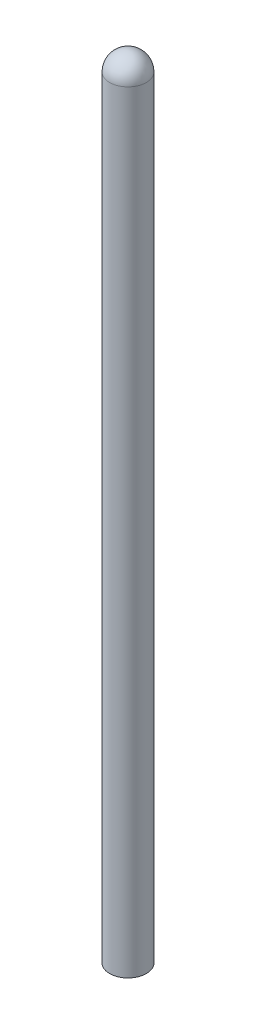
ISO-10303-21;
HEADER;
FILE_DESCRIPTION(('STEP AP214'),'2;1');
FILE_NAME('part.step','',(''),(''),'','','');
FILE_SCHEMA(('AUTOMOTIVE_DESIGN { 1 0 10303 214 1 1 1 1 }'));
ENDSEC;
DATA;
#1=APPLICATION_CONTEXT('core data for automotive mechanical design processes');
#2=APPLICATION_PROTOCOL_DEFINITION('international standard','automotive_design',2000,#1);
#3=PRODUCT_CONTEXT('',#1,'mechanical');
#4=PRODUCT('Part','Part','',(#3));
#5=PRODUCT_RELATED_PRODUCT_CATEGORY('part','',(#4));
#6=PRODUCT_DEFINITION_FORMATION('','',#4);
#7=PRODUCT_DEFINITION_CONTEXT('part definition',#1,'design');
#8=PRODUCT_DEFINITION('design','',#6,#7);
#9=PRODUCT_DEFINITION_SHAPE('','',#8);
#10=(LENGTH_UNIT() NAMED_UNIT(*) SI_UNIT(.MILLI.,.METRE.));
#11=(NAMED_UNIT(*) PLANE_ANGLE_UNIT() SI_UNIT($,.RADIAN.));
#12=(NAMED_UNIT(*) SI_UNIT($,.STERADIAN.) SOLID_ANGLE_UNIT());
#13=UNCERTAINTY_MEASURE_WITH_UNIT(LENGTH_MEASURE(1.E-05),#10,'distance_accuracy_value','');
#14=(GEOMETRIC_REPRESENTATION_CONTEXT(3) GLOBAL_UNCERTAINTY_ASSIGNED_CONTEXT((#13)) GLOBAL_UNIT_ASSIGNED_CONTEXT((#10,
#11,#12)) REPRESENTATION_CONTEXT('',''));
#15=CARTESIAN_POINT('',(0.,0.,0.));
#16=DIRECTION('',(0.,0.,1.));
#17=DIRECTION('',(1.,0.,0.));
#18=AXIS2_PLACEMENT_3D('',#15,#16,#17);
#19=CARTESIAN_POINT('',(0.,105.,0.));
#20=DIRECTION('',(0.,-1.,0.));
#21=DIRECTION('',(0.,0.,-1.));
#22=AXIS2_PLACEMENT_3D('',#19,#20,#21);
#23=CYLINDRICAL_SURFACE('',#22,2.5);
#24=CARTESIAN_POINT('',(0.,105.,0.));
#25=DIRECTION('',(0.,1.,0.));
#26=DIRECTION('',(0.,0.,1.));
#27=AXIS2_PLACEMENT_3D('',#24,#25,#26);
#28=CIRCLE('',#27,2.5);
#29=CARTESIAN_POINT('',(0.,105.,2.5));
#30=VERTEX_POINT('',#29);
#31=EDGE_CURVE('E10',#30,#30,#28,.T.);
#32=ORIENTED_EDGE('',*,*,#31,.F.);
#33=EDGE_LOOP('',(#32));
#34=FACE_BOUND('',#33,.T.);
#35=CARTESIAN_POINT('',(0.,0.,0.));
#36=DIRECTION('',(0.,1.,0.));
#37=DIRECTION('',(0.,0.,1.));
#38=AXIS2_PLACEMENT_3D('',#35,#36,#37);
#39=CIRCLE('',#38,2.5);
#40=CARTESIAN_POINT('',(0.,0.,2.5));
#41=VERTEX_POINT('',#40);
#42=EDGE_CURVE('E40',#41,#41,#39,.T.);
#43=ORIENTED_EDGE('',*,*,#42,.T.);
#44=EDGE_LOOP('',(#43));
#45=FACE_BOUND('',#44,.T.);
#46=ADVANCED_FACE('F37',(#34,#45),#23,.T.);
#47=CARTESIAN_POINT('',(0.,0.,0.));
#48=DIRECTION('',(0.,1.,0.));
#49=DIRECTION('',(0.,0.,1.));
#50=AXIS2_PLACEMENT_3D('',#47,#48,#49);
#51=PLANE('',#50);
#52=ORIENTED_EDGE('',*,*,#42,.F.);
#53=EDGE_LOOP('',(#52));
#54=FACE_BOUND('',#53,.T.);
#55=ADVANCED_FACE('F52',(#54),#51,.F.);
#56=CARTESIAN_POINT('',(0.,105.,0.));
#57=DIRECTION('',(0.,0.,1.));
#58=DIRECTION('',(0.,1.,0.));
#59=AXIS2_PLACEMENT_3D('',#56,#57,#58);
#60=SPHERICAL_SURFACE('',#59,2.5);
#61=CARTESIAN_POINT('',(0.,105.,0.));
#62=DIRECTION('',(0.,1.,0.));
#63=DIRECTION('',(0.,0.,1.));
#64=AXIS2_PLACEMENT_3D('',#61,#62,#63);
#65=SPHERICAL_SURFACE('',#64,2.5);
#66=ORIENTED_EDGE('',*,*,#31,.T.);
#67=EDGE_LOOP('',(#66));
#68=FACE_BOUND('',#67,.T.);
#69=ADVANCED_FACE('F54',(#68),#65,.T.);
#70=CLOSED_SHELL('',(#46,#55,#69));
#71=MANIFOLD_SOLID_BREP('B2',#70);
#72=ADVANCED_BREP_SHAPE_REPRESENTATION('',(#18,#71),#14);
#73=SHAPE_DEFINITION_REPRESENTATION(#9,#72);
ENDSEC;
END-ISO-10303-21;
